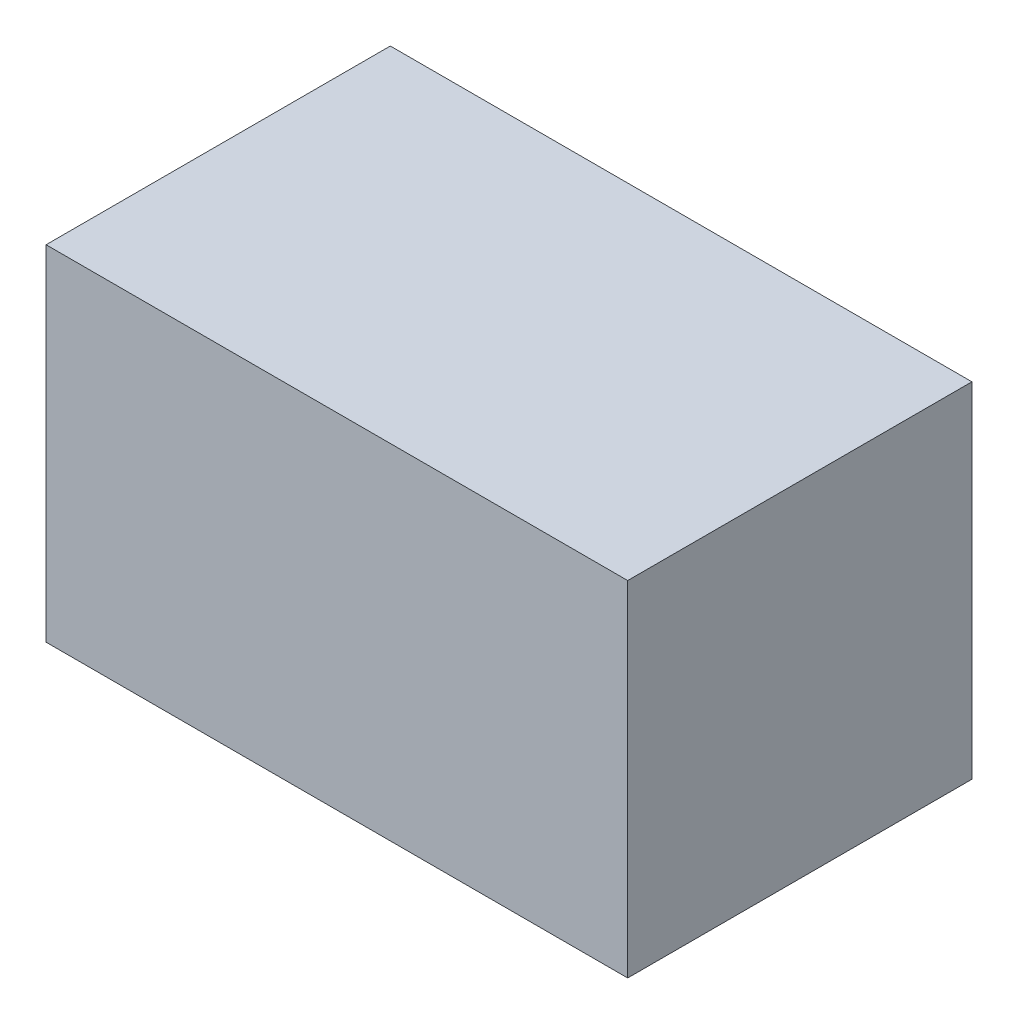
ISO-10303-21;
HEADER;
FILE_DESCRIPTION(('STEP AP214'),'2;1');
FILE_NAME('part.step','',(''),(''),'','','');
FILE_SCHEMA(('AUTOMOTIVE_DESIGN { 1 0 10303 214 1 1 1 1 }'));
ENDSEC;
DATA;
#1=APPLICATION_CONTEXT('core data for automotive mechanical design processes');
#2=APPLICATION_PROTOCOL_DEFINITION('international standard','automotive_design',2000,#1);
#3=PRODUCT_CONTEXT('',#1,'mechanical');
#4=PRODUCT('Part','Part','',(#3));
#5=PRODUCT_RELATED_PRODUCT_CATEGORY('part','',(#4));
#6=PRODUCT_DEFINITION_FORMATION('','',#4);
#7=PRODUCT_DEFINITION_CONTEXT('part definition',#1,'design');
#8=PRODUCT_DEFINITION('design','',#6,#7);
#9=PRODUCT_DEFINITION_SHAPE('','',#8);
#10=(LENGTH_UNIT() NAMED_UNIT(*) SI_UNIT(.MILLI.,.METRE.));
#11=(NAMED_UNIT(*) PLANE_ANGLE_UNIT() SI_UNIT($,.RADIAN.));
#12=(NAMED_UNIT(*) SI_UNIT($,.STERADIAN.) SOLID_ANGLE_UNIT());
#13=UNCERTAINTY_MEASURE_WITH_UNIT(LENGTH_MEASURE(1.E-05),#10,'distance_accuracy_value','');
#14=(GEOMETRIC_REPRESENTATION_CONTEXT(3) GLOBAL_UNCERTAINTY_ASSIGNED_CONTEXT((#13)) GLOBAL_UNIT_ASSIGNED_CONTEXT((#10,
#11,#12)) REPRESENTATION_CONTEXT('',''));
#15=CARTESIAN_POINT('',(0.,0.,0.));
#16=DIRECTION('',(0.,0.,1.));
#17=DIRECTION('',(1.,0.,0.));
#18=AXIS2_PLACEMENT_3D('',#15,#16,#17);
#19=CARTESIAN_POINT('',(-245.,-145.,290.));
#20=DIRECTION('',(1.,0.,0.));
#21=DIRECTION('',(0.,0.,-1.));
#22=AXIS2_PLACEMENT_3D('',#19,#20,#21);
#23=PLANE('',#22);
#24=DIRECTION('',(0.,-1.,0.));
#25=VECTOR('',#24,1.);
#26=CARTESIAN_POINT('',(-245.,-145.,0.));
#27=LINE('',#26,#25);
#28=CARTESIAN_POINT('',(-245.,145.,0.));
#29=VERTEX_POINT('',#28);
#30=CARTESIAN_POINT('',(-245.,-145.,0.));
#31=VERTEX_POINT('',#30);
#32=EDGE_CURVE('E96',#29,#31,#27,.T.);
#33=ORIENTED_EDGE('',*,*,#32,.T.);
#34=DIRECTION('',(0.,0.,-1.));
#35=VECTOR('',#34,1.);
#36=CARTESIAN_POINT('',(-245.,-145.,290.));
#37=LINE('',#36,#35);
#38=CARTESIAN_POINT('',(-245.,-145.,290.));
#39=VERTEX_POINT('',#38);
#40=EDGE_CURVE('E11',#39,#31,#37,.T.);
#41=ORIENTED_EDGE('',*,*,#40,.F.);
#42=DIRECTION('',(0.,-1.,0.));
#43=VECTOR('',#42,1.);
#44=CARTESIAN_POINT('',(-245.,-145.,290.));
#45=LINE('',#44,#43);
#46=CARTESIAN_POINT('',(-245.,145.,290.));
#47=VERTEX_POINT('',#46);
#48=EDGE_CURVE('E84',#47,#39,#45,.T.);
#49=ORIENTED_EDGE('',*,*,#48,.F.);
#50=DIRECTION('',(0.,0.,-1.));
#51=VECTOR('',#50,1.);
#52=CARTESIAN_POINT('',(-245.,145.,290.));
#53=LINE('',#52,#51);
#54=EDGE_CURVE('E92',#47,#29,#53,.T.);
#55=ORIENTED_EDGE('',*,*,#54,.T.);
#56=EDGE_LOOP('',(#33,#41,#49,#55));
#57=FACE_BOUND('',#56,.T.);
#58=ADVANCED_FACE('F33',(#57),#23,.F.);
#59=CARTESIAN_POINT('',(245.,-145.,290.));
#60=DIRECTION('',(0.,1.,0.));
#61=DIRECTION('',(-1.,0.,0.));
#62=AXIS2_PLACEMENT_3D('',#59,#60,#61);
#63=PLANE('',#62);
#64=DIRECTION('',(1.,0.,0.));
#65=VECTOR('',#64,1.);
#66=CARTESIAN_POINT('',(245.,-145.,0.));
#67=LINE('',#66,#65);
#68=CARTESIAN_POINT('',(245.,-145.,0.));
#69=VERTEX_POINT('',#68);
#70=EDGE_CURVE('E88',#31,#69,#67,.T.);
#71=ORIENTED_EDGE('',*,*,#70,.T.);
#72=DIRECTION('',(0.,0.,-1.));
#73=VECTOR('',#72,1.);
#74=CARTESIAN_POINT('',(245.,-145.,290.));
#75=LINE('',#74,#73);
#76=CARTESIAN_POINT('',(245.,-145.,290.));
#77=VERTEX_POINT('',#76);
#78=EDGE_CURVE('E41',#77,#69,#75,.T.);
#79=ORIENTED_EDGE('',*,*,#78,.F.);
#80=DIRECTION('',(1.,0.,0.));
#81=VECTOR('',#80,1.);
#82=CARTESIAN_POINT('',(245.,-145.,290.));
#83=LINE('',#82,#81);
#84=EDGE_CURVE('E79',#39,#77,#83,.T.);
#85=ORIENTED_EDGE('',*,*,#84,.F.);
#86=ORIENTED_EDGE('',*,*,#40,.T.);
#87=EDGE_LOOP('',(#71,#79,#85,#86));
#88=FACE_BOUND('',#87,.T.);
#89=ADVANCED_FACE('F87',(#88),#63,.F.);
#90=CARTESIAN_POINT('',(245.,-145.,290.));
#91=DIRECTION('',(-1.,0.,0.));
#92=DIRECTION('',(0.,-1.,0.));
#93=AXIS2_PLACEMENT_3D('',#90,#91,#92);
#94=PLANE('',#93);
#95=DIRECTION('',(0.,1.,0.));
#96=VECTOR('',#95,1.);
#97=CARTESIAN_POINT('',(245.,-145.,0.));
#98=LINE('',#97,#96);
#99=CARTESIAN_POINT('',(245.,145.,0.));
#100=VERTEX_POINT('',#99);
#101=EDGE_CURVE('E66',#69,#100,#98,.T.);
#102=ORIENTED_EDGE('',*,*,#101,.T.);
#103=DIRECTION('',(0.,0.,-1.));
#104=VECTOR('',#103,1.);
#105=CARTESIAN_POINT('',(245.,145.,290.));
#106=LINE('',#105,#104);
#107=CARTESIAN_POINT('',(245.,145.,290.));
#108=VERTEX_POINT('',#107);
#109=EDGE_CURVE('E89',#108,#100,#106,.T.);
#110=ORIENTED_EDGE('',*,*,#109,.F.);
#111=DIRECTION('',(0.,1.,0.));
#112=VECTOR('',#111,1.);
#113=CARTESIAN_POINT('',(245.,-145.,290.));
#114=LINE('',#113,#112);
#115=EDGE_CURVE('E82',#77,#108,#114,.T.);
#116=ORIENTED_EDGE('',*,*,#115,.F.);
#117=ORIENTED_EDGE('',*,*,#78,.T.);
#118=EDGE_LOOP('',(#102,#110,#116,#117));
#119=FACE_BOUND('',#118,.T.);
#120=ADVANCED_FACE('F90',(#119),#94,.F.);
#121=CARTESIAN_POINT('',(245.,145.,290.));
#122=DIRECTION('',(0.,-1.,0.));
#123=DIRECTION('',(1.,0.,0.));
#124=AXIS2_PLACEMENT_3D('',#121,#122,#123);
#125=PLANE('',#124);
#126=DIRECTION('',(-1.,0.,0.));
#127=VECTOR('',#126,1.);
#128=CARTESIAN_POINT('',(245.,145.,0.));
#129=LINE('',#128,#127);
#130=EDGE_CURVE('E72',#100,#29,#129,.T.);
#131=ORIENTED_EDGE('',*,*,#130,.T.);
#132=ORIENTED_EDGE('',*,*,#54,.F.);
#133=DIRECTION('',(-1.,0.,0.));
#134=VECTOR('',#133,1.);
#135=CARTESIAN_POINT('',(245.,145.,290.));
#136=LINE('',#135,#134);
#137=EDGE_CURVE('E49',#108,#47,#136,.T.);
#138=ORIENTED_EDGE('',*,*,#137,.F.);
#139=ORIENTED_EDGE('',*,*,#109,.T.);
#140=EDGE_LOOP('',(#131,#132,#138,#139));
#141=FACE_BOUND('',#140,.T.);
#142=ADVANCED_FACE('F103',(#141),#125,.F.);
#143=CARTESIAN_POINT('',(0.,0.,290.));
#144=DIRECTION('',(0.,0.,1.));
#145=DIRECTION('',(1.,0.,0.));
#146=AXIS2_PLACEMENT_3D('',#143,#144,#145);
#147=PLANE('',#146);
#148=ORIENTED_EDGE('',*,*,#48,.T.);
#149=ORIENTED_EDGE('',*,*,#84,.T.);
#150=ORIENTED_EDGE('',*,*,#115,.T.);
#151=ORIENTED_EDGE('',*,*,#137,.T.);
#152=EDGE_LOOP('',(#148,#149,#150,#151));
#153=FACE_BOUND('',#152,.T.);
#154=ADVANCED_FACE('F80',(#153),#147,.T.);
#155=CARTESIAN_POINT('',(0.,0.,0.));
#156=DIRECTION('',(0.,0.,1.));
#157=DIRECTION('',(1.,0.,0.));
#158=AXIS2_PLACEMENT_3D('',#155,#156,#157);
#159=PLANE('',#158);
#160=ORIENTED_EDGE('',*,*,#32,.F.);
#161=ORIENTED_EDGE('',*,*,#130,.F.);
#162=ORIENTED_EDGE('',*,*,#101,.F.);
#163=ORIENTED_EDGE('',*,*,#70,.F.);
#164=EDGE_LOOP('',(#160,#161,#162,#163));
#165=FACE_BOUND('',#164,.T.);
#166=ADVANCED_FACE('F106',(#165),#159,.F.);
#167=CLOSED_SHELL('',(#58,#89,#120,#142,#154,#166));
#168=MANIFOLD_SOLID_BREP('B2',#167);
#169=ADVANCED_BREP_SHAPE_REPRESENTATION('',(#18,#168),#14);
#170=SHAPE_DEFINITION_REPRESENTATION(#9,#169);
ENDSEC;
END-ISO-10303-21;
